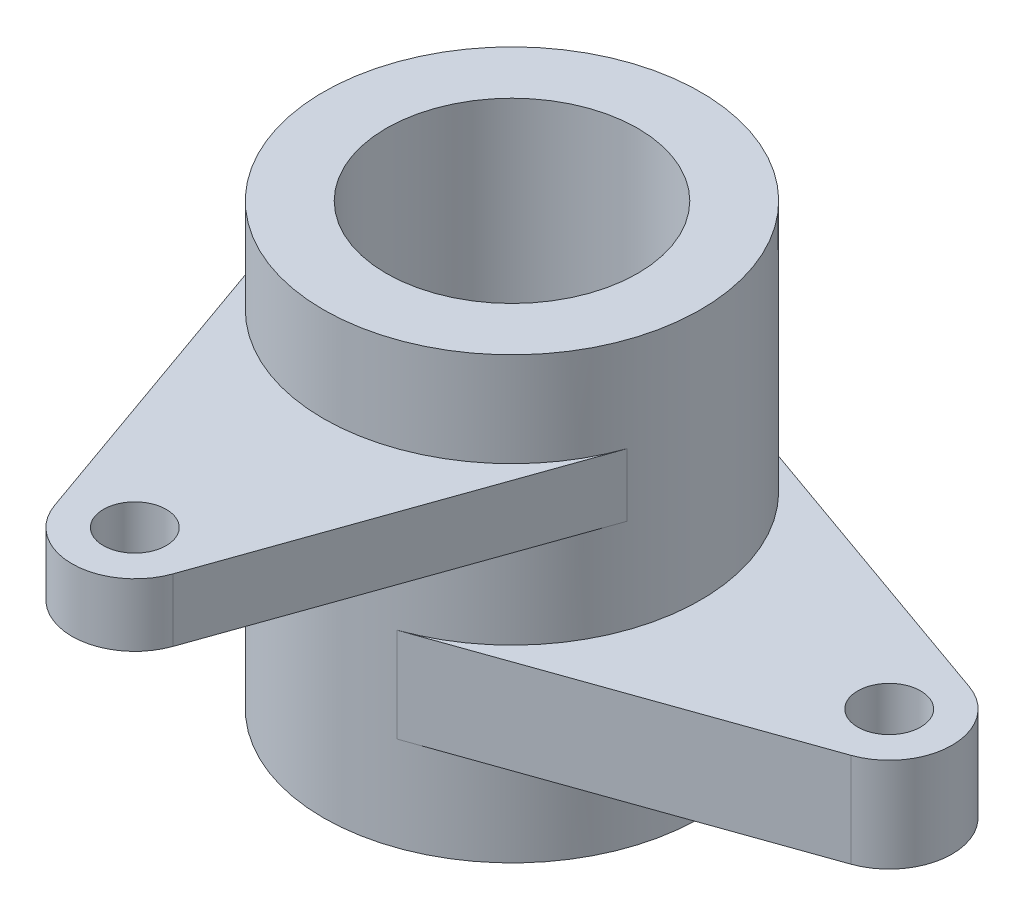
ISO-10303-21;
HEADER;
FILE_DESCRIPTION(('STEP AP214'),'2;1');
FILE_NAME('part.step','',(''),(''),'','','');
FILE_SCHEMA(('AUTOMOTIVE_DESIGN { 1 0 10303 214 1 1 1 1 }'));
ENDSEC;
DATA;
#1=APPLICATION_CONTEXT('core data for automotive mechanical design processes');
#2=APPLICATION_PROTOCOL_DEFINITION('international standard','automotive_design',2000,#1);
#3=PRODUCT_CONTEXT('',#1,'mechanical');
#4=PRODUCT('Part','Part','',(#3));
#5=PRODUCT_RELATED_PRODUCT_CATEGORY('part','',(#4));
#6=PRODUCT_DEFINITION_FORMATION('','',#4);
#7=PRODUCT_DEFINITION_CONTEXT('part definition',#1,'design');
#8=PRODUCT_DEFINITION('design','',#6,#7);
#9=PRODUCT_DEFINITION_SHAPE('','',#8);
#10=(LENGTH_UNIT() NAMED_UNIT(*) SI_UNIT(.MILLI.,.METRE.));
#11=(NAMED_UNIT(*) PLANE_ANGLE_UNIT() SI_UNIT($,.RADIAN.));
#12=(NAMED_UNIT(*) SI_UNIT($,.STERADIAN.) SOLID_ANGLE_UNIT());
#13=UNCERTAINTY_MEASURE_WITH_UNIT(LENGTH_MEASURE(1.E-05),#10,'distance_accuracy_value','');
#14=(GEOMETRIC_REPRESENTATION_CONTEXT(3) GLOBAL_UNCERTAINTY_ASSIGNED_CONTEXT((#13)) GLOBAL_UNIT_ASSIGNED_CONTEXT((#10,
#11,#12)) REPRESENTATION_CONTEXT('',''));
#15=CARTESIAN_POINT('',(0.,0.,0.));
#16=DIRECTION('',(0.,0.,1.));
#17=DIRECTION('',(1.,0.,0.));
#18=AXIS2_PLACEMENT_3D('',#15,#16,#17);
#19=CARTESIAN_POINT('',(0.,70.,0.));
#20=DIRECTION('',(0.,-1.,0.));
#21=DIRECTION('',(0.,0.,-1.));
#22=AXIS2_PLACEMENT_3D('',#19,#20,#21);
#23=CYLINDRICAL_SURFACE('',#22,30.);
#24=CARTESIAN_POINT('',(0.,55.,0.));
#25=DIRECTION('',(0.,-1.,0.));
#26=DIRECTION('',(0.,0.,1.));
#27=AXIS2_PLACEMENT_3D('',#24,#25,#26);
#28=CIRCLE('',#27,30.);
#29=CARTESIAN_POINT('',(28.2842712474619,55.,9.99999999999999));
#30=VERTEX_POINT('',#29);
#31=CARTESIAN_POINT('',(-28.2842712474619,55.,10.));
#32=VERTEX_POINT('',#31);
#33=EDGE_CURVE('E54',#30,#32,#28,.T.);
#34=ORIENTED_EDGE('',*,*,#33,.F.);
#35=DIRECTION('',(0.,-1.,0.));
#36=VECTOR('',#35,1.);
#37=CARTESIAN_POINT('',(28.2842712474619,55.,9.99999999999999));
#38=LINE('',#37,#36);
#39=CARTESIAN_POINT('',(28.2842712474619,45.,10.));
#40=VERTEX_POINT('',#39);
#41=EDGE_CURVE('E59',#30,#40,#38,.T.);
#42=ORIENTED_EDGE('',*,*,#41,.T.);
#43=CARTESIAN_POINT('',(0.,45.,0.));
#44=DIRECTION('',(0.,-1.,0.));
#45=DIRECTION('',(0.,0.,1.));
#46=AXIS2_PLACEMENT_3D('',#43,#44,#45);
#47=CIRCLE('',#46,30.);
#48=CARTESIAN_POINT('',(-28.2842712474619,45.,9.99999999999999));
#49=VERTEX_POINT('',#48);
#50=EDGE_CURVE('E296',#40,#49,#47,.T.);
#51=ORIENTED_EDGE('',*,*,#50,.T.);
#52=DIRECTION('',(0.,-1.,0.));
#53=VECTOR('',#52,1.);
#54=CARTESIAN_POINT('',(-28.2842712474619,55.,9.99999999999999));
#55=LINE('',#54,#53);
#56=EDGE_CURVE('E134',#32,#49,#55,.T.);
#57=ORIENTED_EDGE('',*,*,#56,.F.);
#58=EDGE_LOOP('',(#34,#42,#51,#57));
#59=FACE_BOUND('',#58,.T.);
#60=CARTESIAN_POINT('',(0.,0.,0.));
#61=DIRECTION('',(0.,1.,0.));
#62=DIRECTION('',(0.,0.,1.));
#63=AXIS2_PLACEMENT_3D('',#60,#61,#62);
#64=CIRCLE('',#63,30.);
#65=CARTESIAN_POINT('',(0.,0.,30.));
#66=VERTEX_POINT('',#65);
#67=EDGE_CURVE('E42',#66,#66,#64,.T.);
#68=ORIENTED_EDGE('',*,*,#67,.T.);
#69=EDGE_LOOP('',(#68));
#70=FACE_BOUND('',#69,.T.);
#71=CARTESIAN_POINT('',(0.,70.,0.));
#72=DIRECTION('',(0.,1.,0.));
#73=DIRECTION('',(0.,0.,1.));
#74=AXIS2_PLACEMENT_3D('',#71,#72,#73);
#75=CIRCLE('',#74,30.);
#76=CARTESIAN_POINT('',(0.,70.,30.));
#77=VERTEX_POINT('',#76);
#78=EDGE_CURVE('E11',#77,#77,#75,.T.);
#79=ORIENTED_EDGE('',*,*,#78,.F.);
#80=EDGE_LOOP('',(#79));
#81=FACE_BOUND('',#80,.T.);
#82=DIRECTION('',(0.,-1.,0.));
#83=VECTOR('',#82,1.);
#84=CARTESIAN_POINT('',(10.,30.,28.2842712474619));
#85=LINE('',#84,#83);
#86=CARTESIAN_POINT('',(10.,30.,28.2842712474619));
#87=VERTEX_POINT('',#86);
#88=CARTESIAN_POINT('',(10.,15.,28.2842712474619));
#89=VERTEX_POINT('',#88);
#90=EDGE_CURVE('E180',#87,#89,#85,.T.);
#91=ORIENTED_EDGE('',*,*,#90,.F.);
#92=CARTESIAN_POINT('',(0.,30.,0.));
#93=DIRECTION('',(0.,-1.,0.));
#94=DIRECTION('',(0.,0.,1.));
#95=AXIS2_PLACEMENT_3D('',#92,#93,#94);
#96=CIRCLE('',#95,30.);
#97=CARTESIAN_POINT('',(10.,30.,-28.2842712474619));
#98=VERTEX_POINT('',#97);
#99=EDGE_CURVE('E142',#98,#87,#96,.T.);
#100=ORIENTED_EDGE('',*,*,#99,.F.);
#101=DIRECTION('',(0.,-1.,0.));
#102=VECTOR('',#101,1.);
#103=CARTESIAN_POINT('',(10.,30.,-28.2842712474619));
#104=LINE('',#103,#102);
#105=CARTESIAN_POINT('',(10.,15.,-28.2842712474619));
#106=VERTEX_POINT('',#105);
#107=EDGE_CURVE('E156',#98,#106,#104,.T.);
#108=ORIENTED_EDGE('',*,*,#107,.T.);
#109=CARTESIAN_POINT('',(0.,15.,0.));
#110=DIRECTION('',(0.,-1.,0.));
#111=DIRECTION('',(0.,0.,1.));
#112=AXIS2_PLACEMENT_3D('',#109,#110,#111);
#113=CIRCLE('',#112,30.);
#114=EDGE_CURVE('E140',#106,#89,#113,.T.);
#115=ORIENTED_EDGE('',*,*,#114,.T.);
#116=EDGE_LOOP('',(#91,#100,#108,#115));
#117=FACE_BOUND('',#116,.T.);
#118=ADVANCED_FACE('F39',(#59,#70,#81,#117),#23,.T.);
#119=CARTESIAN_POINT('',(0.,70.,0.));
#120=DIRECTION('',(0.,1.,0.));
#121=DIRECTION('',(0.,0.,1.));
#122=AXIS2_PLACEMENT_3D('',#119,#120,#121);
#123=PLANE('',#122);
#124=ORIENTED_EDGE('',*,*,#78,.T.);
#125=EDGE_LOOP('',(#124));
#126=FACE_BOUND('',#125,.T.);
#127=CARTESIAN_POINT('',(0.,70.,0.));
#128=DIRECTION('',(0.,1.,0.));
#129=DIRECTION('',(0.,0.,1.));
#130=AXIS2_PLACEMENT_3D('',#127,#128,#129);
#131=CIRCLE('',#130,20.);
#132=CARTESIAN_POINT('',(0.,70.,20.));
#133=VERTEX_POINT('',#132);
#134=EDGE_CURVE('E185',#133,#133,#131,.T.);
#135=ORIENTED_EDGE('',*,*,#134,.F.);
#136=EDGE_LOOP('',(#135));
#137=FACE_BOUND('',#136,.T.);
#138=ADVANCED_FACE('F207',(#126,#137),#123,.T.);
#139=CARTESIAN_POINT('',(0.,0.,0.));
#140=DIRECTION('',(0.,1.,0.));
#141=DIRECTION('',(0.,0.,1.));
#142=AXIS2_PLACEMENT_3D('',#139,#140,#141);
#143=PLANE('',#142);
#144=ORIENTED_EDGE('',*,*,#67,.F.);
#145=EDGE_LOOP('',(#144));
#146=FACE_BOUND('',#145,.T.);
#147=CARTESIAN_POINT('',(0.,0.,0.));
#148=DIRECTION('',(0.,1.,0.));
#149=DIRECTION('',(0.,0.,1.));
#150=AXIS2_PLACEMENT_3D('',#147,#148,#149);
#151=CIRCLE('',#150,20.);
#152=CARTESIAN_POINT('',(0.,0.,20.));
#153=VERTEX_POINT('',#152);
#154=EDGE_CURVE('E184',#153,#153,#151,.T.);
#155=ORIENTED_EDGE('',*,*,#154,.T.);
#156=EDGE_LOOP('',(#155));
#157=FACE_BOUND('',#156,.T.);
#158=ADVANCED_FACE('F193',(#146,#157),#143,.F.);
#159=CARTESIAN_POINT('',(0.,70.,0.));
#160=DIRECTION('',(0.,-1.,0.));
#161=DIRECTION('',(0.,0.,-1.));
#162=AXIS2_PLACEMENT_3D('',#159,#160,#161);
#163=CYLINDRICAL_SURFACE('',#162,20.);
#164=ORIENTED_EDGE('',*,*,#134,.T.);
#165=EDGE_LOOP('',(#164));
#166=FACE_BOUND('',#165,.T.);
#167=ORIENTED_EDGE('',*,*,#154,.F.);
#168=EDGE_LOOP('',(#167));
#169=FACE_BOUND('',#168,.T.);
#170=ADVANCED_FACE('F195',(#166,#169),#163,.F.);
#171=CARTESIAN_POINT('',(0.,30.,0.));
#172=DIRECTION('',(0.,1.,0.));
#173=DIRECTION('',(0.,0.,1.));
#174=AXIS2_PLACEMENT_3D('',#171,#172,#173);
#175=PLANE('',#174);
#176=ORIENTED_EDGE('',*,*,#99,.T.);
#177=DIRECTION('',(0.942809041582063,0.,-0.333333333333333));
#178=VECTOR('',#177,1.);
#179=CARTESIAN_POINT('',(63.3333333333333,30.,9.42809041582064));
#180=LINE('',#179,#178);
#181=CARTESIAN_POINT('',(63.3333333333333,30.,9.42809041582063));
#182=VERTEX_POINT('',#181);
#183=EDGE_CURVE('E146',#87,#182,#180,.T.);
#184=ORIENTED_EDGE('',*,*,#183,.T.);
#185=CARTESIAN_POINT('',(60.,30.,0.));
#186=DIRECTION('',(0.,1.,0.));
#187=DIRECTION('',(0.,0.,1.));
#188=AXIS2_PLACEMENT_3D('',#185,#186,#187);
#189=CIRCLE('',#188,10.);
#190=CARTESIAN_POINT('',(63.3333333333333,30.,-9.42809041582063));
#191=VERTEX_POINT('',#190);
#192=EDGE_CURVE('E150',#182,#191,#189,.T.);
#193=ORIENTED_EDGE('',*,*,#192,.T.);
#194=DIRECTION('',(-0.942809041582063,0.,-0.333333333333334));
#195=VECTOR('',#194,1.);
#196=CARTESIAN_POINT('',(63.3333333333333,30.,-9.42809041582063));
#197=LINE('',#196,#195);
#198=EDGE_CURVE('E153',#191,#98,#197,.T.);
#199=ORIENTED_EDGE('',*,*,#198,.T.);
#200=EDGE_LOOP('',(#176,#184,#193,#199));
#201=FACE_BOUND('',#200,.T.);
#202=CARTESIAN_POINT('',(60.,30.,0.));
#203=DIRECTION('',(0.,1.,0.));
#204=DIRECTION('',(0.,0.,1.));
#205=AXIS2_PLACEMENT_3D('',#202,#203,#204);
#206=CIRCLE('',#205,5.);
#207=CARTESIAN_POINT('',(60.,30.,5.));
#208=VERTEX_POINT('',#207);
#209=EDGE_CURVE('E132',#208,#208,#206,.T.);
#210=ORIENTED_EDGE('',*,*,#209,.F.);
#211=EDGE_LOOP('',(#210));
#212=FACE_BOUND('',#211,.T.);
#213=ADVANCED_FACE('F197',(#201,#212),#175,.T.);
#214=CARTESIAN_POINT('',(0.,15.,0.));
#215=DIRECTION('',(0.,1.,0.));
#216=DIRECTION('',(0.,0.,1.));
#217=AXIS2_PLACEMENT_3D('',#214,#215,#216);
#218=PLANE('',#217);
#219=ORIENTED_EDGE('',*,*,#114,.F.);
#220=DIRECTION('',(-0.942809041582063,0.,-0.333333333333334));
#221=VECTOR('',#220,1.);
#222=CARTESIAN_POINT('',(63.3333333333333,15.,-9.42809041582063));
#223=LINE('',#222,#221);
#224=CARTESIAN_POINT('',(63.3333333333333,15.,-9.42809041582063));
#225=VERTEX_POINT('',#224);
#226=EDGE_CURVE('E147',#225,#106,#223,.T.);
#227=ORIENTED_EDGE('',*,*,#226,.F.);
#228=CARTESIAN_POINT('',(60.,15.,0.));
#229=DIRECTION('',(0.,1.,0.));
#230=DIRECTION('',(0.,0.,1.));
#231=AXIS2_PLACEMENT_3D('',#228,#229,#230);
#232=CIRCLE('',#231,10.);
#233=CARTESIAN_POINT('',(63.3333333333333,15.,9.42809041582063));
#234=VERTEX_POINT('',#233);
#235=EDGE_CURVE('E163',#234,#225,#232,.T.);
#236=ORIENTED_EDGE('',*,*,#235,.F.);
#237=DIRECTION('',(0.942809041582063,0.,-0.333333333333333));
#238=VECTOR('',#237,1.);
#239=CARTESIAN_POINT('',(63.3333333333333,15.,9.42809041582064));
#240=LINE('',#239,#238);
#241=EDGE_CURVE('E160',#89,#234,#240,.T.);
#242=ORIENTED_EDGE('',*,*,#241,.F.);
#243=EDGE_LOOP('',(#219,#227,#236,#242));
#244=FACE_BOUND('',#243,.T.);
#245=CARTESIAN_POINT('',(60.,15.,0.));
#246=DIRECTION('',(0.,1.,0.));
#247=DIRECTION('',(0.,0.,1.));
#248=AXIS2_PLACEMENT_3D('',#245,#246,#247);
#249=CIRCLE('',#248,5.);
#250=CARTESIAN_POINT('',(60.,15.,5.));
#251=VERTEX_POINT('',#250);
#252=EDGE_CURVE('E127',#251,#251,#249,.T.);
#253=ORIENTED_EDGE('',*,*,#252,.T.);
#254=EDGE_LOOP('',(#253));
#255=FACE_BOUND('',#254,.T.);
#256=ADVANCED_FACE('F204',(#244,#255),#218,.F.);
#257=CARTESIAN_POINT('',(63.3333333333333,30.,9.42809041582064));
#258=DIRECTION('',(-0.333333333333333,0.,-0.942809041582063));
#259=DIRECTION('',(-0.942809041582063,0.,0.333333333333333));
#260=AXIS2_PLACEMENT_3D('',#257,#258,#259);
#261=PLANE('',#260);
#262=ORIENTED_EDGE('',*,*,#241,.T.);
#263=DIRECTION('',(0.,-1.,0.));
#264=VECTOR('',#263,1.);
#265=CARTESIAN_POINT('',(63.3333333333333,30.,9.42809041582063));
#266=LINE('',#265,#264);
#267=EDGE_CURVE('E176',#182,#234,#266,.T.);
#268=ORIENTED_EDGE('',*,*,#267,.F.);
#269=ORIENTED_EDGE('',*,*,#183,.F.);
#270=ORIENTED_EDGE('',*,*,#90,.T.);
#271=EDGE_LOOP('',(#262,#268,#269,#270));
#272=FACE_BOUND('',#271,.T.);
#273=ADVANCED_FACE('F225',(#272),#261,.F.);
#274=CARTESIAN_POINT('',(60.,30.,0.));
#275=DIRECTION('',(0.,-1.,0.));
#276=DIRECTION('',(0.,0.,-1.));
#277=AXIS2_PLACEMENT_3D('',#274,#275,#276);
#278=CYLINDRICAL_SURFACE('',#277,10.);
#279=ORIENTED_EDGE('',*,*,#235,.T.);
#280=DIRECTION('',(0.,-1.,0.));
#281=VECTOR('',#280,1.);
#282=CARTESIAN_POINT('',(63.3333333333333,30.,-9.42809041582063));
#283=LINE('',#282,#281);
#284=EDGE_CURVE('E172',#191,#225,#283,.T.);
#285=ORIENTED_EDGE('',*,*,#284,.F.);
#286=ORIENTED_EDGE('',*,*,#192,.F.);
#287=ORIENTED_EDGE('',*,*,#267,.T.);
#288=EDGE_LOOP('',(#279,#285,#286,#287));
#289=FACE_BOUND('',#288,.T.);
#290=ADVANCED_FACE('F239',(#289),#278,.T.);
#291=CARTESIAN_POINT('',(63.3333333333333,30.,-9.42809041582063));
#292=DIRECTION('',(-0.333333333333334,0.,0.942809041582063));
#293=DIRECTION('',(0.942809041582063,0.,0.333333333333334));
#294=AXIS2_PLACEMENT_3D('',#291,#292,#293);
#295=PLANE('',#294);
#296=ORIENTED_EDGE('',*,*,#226,.T.);
#297=ORIENTED_EDGE('',*,*,#107,.F.);
#298=ORIENTED_EDGE('',*,*,#198,.F.);
#299=ORIENTED_EDGE('',*,*,#284,.T.);
#300=EDGE_LOOP('',(#296,#297,#298,#299));
#301=FACE_BOUND('',#300,.T.);
#302=ADVANCED_FACE('F233',(#301),#295,.F.);
#303=CARTESIAN_POINT('',(60.,30.,0.));
#304=DIRECTION('',(0.,-1.,0.));
#305=DIRECTION('',(0.,0.,-1.));
#306=AXIS2_PLACEMENT_3D('',#303,#304,#305);
#307=CYLINDRICAL_SURFACE('',#306,5.);
#308=ORIENTED_EDGE('',*,*,#209,.T.);
#309=EDGE_LOOP('',(#308));
#310=FACE_BOUND('',#309,.T.);
#311=ORIENTED_EDGE('',*,*,#252,.F.);
#312=EDGE_LOOP('',(#311));
#313=FACE_BOUND('',#312,.T.);
#314=ADVANCED_FACE('F246',(#310,#313),#307,.F.);
#315=CARTESIAN_POINT('',(0.,55.,60.));
#316=DIRECTION('',(0.,1.,0.));
#317=DIRECTION('',(0.,0.,1.));
#318=AXIS2_PLACEMENT_3D('',#315,#316,#317);
#319=PLANE('',#318);
#320=CARTESIAN_POINT('',(0.,55.,60.));
#321=DIRECTION('',(0.,1.,0.));
#322=DIRECTION('',(0.,0.,1.));
#323=AXIS2_PLACEMENT_3D('',#320,#321,#322);
#324=CIRCLE('',#323,10.);
#325=CARTESIAN_POINT('',(-9.42809041582063,55.,63.3333333333333));
#326=VERTEX_POINT('',#325);
#327=CARTESIAN_POINT('',(9.42809041582064,55.,63.3333333333333));
#328=VERTEX_POINT('',#327);
#329=EDGE_CURVE('E110',#326,#328,#324,.T.);
#330=ORIENTED_EDGE('',*,*,#329,.T.);
#331=DIRECTION('',(0.333333333333333,0.,-0.942809041582063));
#332=VECTOR('',#331,1.);
#333=CARTESIAN_POINT('',(9.42809041582064,55.,63.3333333333333));
#334=LINE('',#333,#332);
#335=EDGE_CURVE('E102',#328,#30,#334,.T.);
#336=ORIENTED_EDGE('',*,*,#335,.T.);
#337=ORIENTED_EDGE('',*,*,#33,.T.);
#338=DIRECTION('',(0.333333333333333,0.,0.942809041582063));
#339=VECTOR('',#338,1.);
#340=CARTESIAN_POINT('',(-9.42809041582063,55.,63.3333333333333));
#341=LINE('',#340,#339);
#342=EDGE_CURVE('E116',#32,#326,#341,.T.);
#343=ORIENTED_EDGE('',*,*,#342,.T.);
#344=EDGE_LOOP('',(#330,#336,#337,#343));
#345=FACE_BOUND('',#344,.T.);
#346=CARTESIAN_POINT('',(0.,55.,60.));
#347=DIRECTION('',(0.,1.,0.));
#348=DIRECTION('',(0.,0.,1.));
#349=AXIS2_PLACEMENT_3D('',#346,#347,#348);
#350=CIRCLE('',#349,5.);
#351=CARTESIAN_POINT('',(0.,55.,65.));
#352=VERTEX_POINT('',#351);
#353=EDGE_CURVE('E276',#352,#352,#350,.T.);
#354=ORIENTED_EDGE('',*,*,#353,.F.);
#355=EDGE_LOOP('',(#354));
#356=FACE_BOUND('',#355,.T.);
#357=ADVANCED_FACE('F113',(#345,#356),#319,.T.);
#358=CARTESIAN_POINT('',(0.,45.,60.));
#359=DIRECTION('',(0.,1.,0.));
#360=DIRECTION('',(0.,0.,1.));
#361=AXIS2_PLACEMENT_3D('',#358,#359,#360);
#362=PLANE('',#361);
#363=CARTESIAN_POINT('',(0.,45.,60.));
#364=DIRECTION('',(0.,1.,0.));
#365=DIRECTION('',(0.,0.,1.));
#366=AXIS2_PLACEMENT_3D('',#363,#364,#365);
#367=CIRCLE('',#366,10.);
#368=CARTESIAN_POINT('',(-9.42809041582063,45.,63.3333333333333));
#369=VERTEX_POINT('',#368);
#370=CARTESIAN_POINT('',(9.42809041582064,45.,63.3333333333333));
#371=VERTEX_POINT('',#370);
#372=EDGE_CURVE('E125',#369,#371,#367,.T.);
#373=ORIENTED_EDGE('',*,*,#372,.F.);
#374=DIRECTION('',(0.333333333333333,0.,0.942809041582063));
#375=VECTOR('',#374,1.);
#376=CARTESIAN_POINT('',(-9.42809041582063,45.,63.3333333333333));
#377=LINE('',#376,#375);
#378=EDGE_CURVE('E121',#49,#369,#377,.T.);
#379=ORIENTED_EDGE('',*,*,#378,.F.);
#380=ORIENTED_EDGE('',*,*,#50,.F.);
#381=DIRECTION('',(0.333333333333333,0.,-0.942809041582063));
#382=VECTOR('',#381,1.);
#383=CARTESIAN_POINT('',(9.42809041582064,45.,63.3333333333333));
#384=LINE('',#383,#382);
#385=EDGE_CURVE('E293',#371,#40,#384,.T.);
#386=ORIENTED_EDGE('',*,*,#385,.F.);
#387=EDGE_LOOP('',(#373,#379,#380,#386));
#388=FACE_BOUND('',#387,.T.);
#389=CARTESIAN_POINT('',(0.,45.,60.));
#390=DIRECTION('',(0.,1.,0.));
#391=DIRECTION('',(0.,0.,1.));
#392=AXIS2_PLACEMENT_3D('',#389,#390,#391);
#393=CIRCLE('',#392,5.);
#394=CARTESIAN_POINT('',(0.,45.,65.));
#395=VERTEX_POINT('',#394);
#396=EDGE_CURVE('E279',#395,#395,#393,.T.);
#397=ORIENTED_EDGE('',*,*,#396,.T.);
#398=EDGE_LOOP('',(#397));
#399=FACE_BOUND('',#398,.T.);
#400=ADVANCED_FACE('F256',(#388,#399),#362,.F.);
#401=CARTESIAN_POINT('',(0.,55.,60.));
#402=DIRECTION('',(0.,-1.,0.));
#403=DIRECTION('',(0.,0.,-1.));
#404=AXIS2_PLACEMENT_3D('',#401,#402,#403);
#405=CYLINDRICAL_SURFACE('',#404,10.);
#406=ORIENTED_EDGE('',*,*,#372,.T.);
#407=DIRECTION('',(0.,-1.,0.));
#408=VECTOR('',#407,1.);
#409=CARTESIAN_POINT('',(9.42809041582064,55.,63.3333333333333));
#410=LINE('',#409,#408);
#411=EDGE_CURVE('E106',#328,#371,#410,.T.);
#412=ORIENTED_EDGE('',*,*,#411,.F.);
#413=ORIENTED_EDGE('',*,*,#329,.F.);
#414=DIRECTION('',(0.,-1.,0.));
#415=VECTOR('',#414,1.);
#416=CARTESIAN_POINT('',(-9.42809041582063,55.,63.3333333333333));
#417=LINE('',#416,#415);
#418=EDGE_CURVE('E290',#326,#369,#417,.T.);
#419=ORIENTED_EDGE('',*,*,#418,.T.);
#420=EDGE_LOOP('',(#406,#412,#413,#419));
#421=FACE_BOUND('',#420,.T.);
#422=ADVANCED_FACE('F123',(#421),#405,.T.);
#423=CARTESIAN_POINT('',(9.42809041582064,55.,63.3333333333333));
#424=DIRECTION('',(-0.942809041582063,0.,-0.333333333333333));
#425=DIRECTION('',(-0.333333333333333,0.,0.942809041582063));
#426=AXIS2_PLACEMENT_3D('',#423,#424,#425);
#427=PLANE('',#426);
#428=ORIENTED_EDGE('',*,*,#385,.T.);
#429=ORIENTED_EDGE('',*,*,#41,.F.);
#430=ORIENTED_EDGE('',*,*,#335,.F.);
#431=ORIENTED_EDGE('',*,*,#411,.T.);
#432=EDGE_LOOP('',(#428,#429,#430,#431));
#433=FACE_BOUND('',#432,.T.);
#434=ADVANCED_FACE('F104',(#433),#427,.F.);
#435=CARTESIAN_POINT('',(-9.42809041582063,55.,63.3333333333333));
#436=DIRECTION('',(0.942809041582063,0.,-0.333333333333333));
#437=DIRECTION('',(-0.333333333333333,0.,-0.942809041582063));
#438=AXIS2_PLACEMENT_3D('',#435,#436,#437);
#439=PLANE('',#438);
#440=ORIENTED_EDGE('',*,*,#378,.T.);
#441=ORIENTED_EDGE('',*,*,#418,.F.);
#442=ORIENTED_EDGE('',*,*,#342,.F.);
#443=ORIENTED_EDGE('',*,*,#56,.T.);
#444=EDGE_LOOP('',(#440,#441,#442,#443));
#445=FACE_BOUND('',#444,.T.);
#446=ADVANCED_FACE('F259',(#445),#439,.F.);
#447=CARTESIAN_POINT('',(0.,55.,60.));
#448=DIRECTION('',(0.,-1.,0.));
#449=DIRECTION('',(0.,0.,-1.));
#450=AXIS2_PLACEMENT_3D('',#447,#448,#449);
#451=CYLINDRICAL_SURFACE('',#450,5.);
#452=ORIENTED_EDGE('',*,*,#353,.T.);
#453=EDGE_LOOP('',(#452));
#454=FACE_BOUND('',#453,.T.);
#455=ORIENTED_EDGE('',*,*,#396,.F.);
#456=EDGE_LOOP('',(#455));
#457=FACE_BOUND('',#456,.T.);
#458=ADVANCED_FACE('F262',(#454,#457),#451,.F.);
#459=CLOSED_SHELL('',(#118,#138,#158,#170,#213,#256,#273,#290,#302,#314,#357,#400,#422,#434,
#446,#458));
#460=MANIFOLD_SOLID_BREP('B2',#459);
#461=ADVANCED_BREP_SHAPE_REPRESENTATION('',(#18,#460),#14);
#462=SHAPE_DEFINITION_REPRESENTATION(#9,#461);
ENDSEC;
END-ISO-10303-21;
